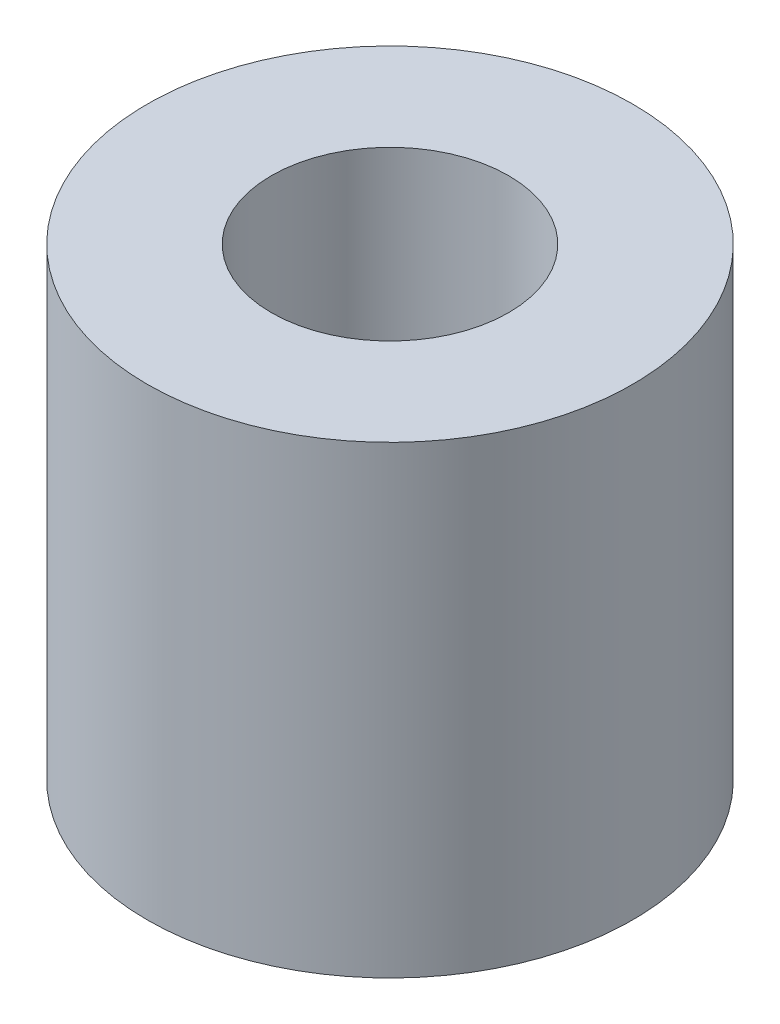
ISO-10303-21;
HEADER;
FILE_DESCRIPTION(('STEP AP214'),'2;1');
FILE_NAME('part.step','',(''),(''),'','','');
FILE_SCHEMA(('AUTOMOTIVE_DESIGN { 1 0 10303 214 1 1 1 1 }'));
ENDSEC;
DATA;
#1=APPLICATION_CONTEXT('core data for automotive mechanical design processes');
#2=APPLICATION_PROTOCOL_DEFINITION('international standard','automotive_design',2000,#1);
#3=PRODUCT_CONTEXT('',#1,'mechanical');
#4=PRODUCT('Part','Part','',(#3));
#5=PRODUCT_RELATED_PRODUCT_CATEGORY('part','',(#4));
#6=PRODUCT_DEFINITION_FORMATION('','',#4);
#7=PRODUCT_DEFINITION_CONTEXT('part definition',#1,'design');
#8=PRODUCT_DEFINITION('design','',#6,#7);
#9=PRODUCT_DEFINITION_SHAPE('','',#8);
#10=(LENGTH_UNIT() NAMED_UNIT(*) SI_UNIT(.MILLI.,.METRE.));
#11=(NAMED_UNIT(*) PLANE_ANGLE_UNIT() SI_UNIT($,.RADIAN.));
#12=(NAMED_UNIT(*) SI_UNIT($,.STERADIAN.) SOLID_ANGLE_UNIT());
#13=UNCERTAINTY_MEASURE_WITH_UNIT(LENGTH_MEASURE(1.E-05),#10,'distance_accuracy_value','');
#14=(GEOMETRIC_REPRESENTATION_CONTEXT(3) GLOBAL_UNCERTAINTY_ASSIGNED_CONTEXT((#13)) GLOBAL_UNIT_ASSIGNED_CONTEXT((#10,
#11,#12)) REPRESENTATION_CONTEXT('',''));
#15=CARTESIAN_POINT('',(0.,0.,0.));
#16=DIRECTION('',(0.,0.,1.));
#17=DIRECTION('',(1.,0.,0.));
#18=AXIS2_PLACEMENT_3D('',#15,#16,#17);
#19=CARTESIAN_POINT('',(0.,4.3,0.));
#20=DIRECTION('',(0.,1.,0.));
#21=DIRECTION('',(0.,0.,1.));
#22=AXIS2_PLACEMENT_3D('',#19,#20,#21);
#23=PLANE('',#22);
#24=CARTESIAN_POINT('',(0.,4.3,0.));
#25=DIRECTION('',(0.,1.,0.));
#26=DIRECTION('',(0.,0.,1.));
#27=AXIS2_PLACEMENT_3D('',#24,#25,#26);
#28=CIRCLE('',#27,2.25);
#29=CARTESIAN_POINT('',(0.,4.3,-2.25));
#30=VERTEX_POINT('',#29);
#31=EDGE_CURVE('E10',#30,#30,#28,.T.);
#32=ORIENTED_EDGE('',*,*,#31,.T.);
#33=EDGE_LOOP('',(#32));
#34=FACE_BOUND('',#33,.T.);
#35=CARTESIAN_POINT('',(0.,4.3,0.));
#36=DIRECTION('',(0.,1.,0.));
#37=DIRECTION('',(0.,0.,1.));
#38=AXIS2_PLACEMENT_3D('',#35,#36,#37);
#39=CIRCLE('',#38,1.1);
#40=CARTESIAN_POINT('',(0.,4.3,-1.1));
#41=VERTEX_POINT('',#40);
#42=EDGE_CURVE('E50',#41,#41,#39,.T.);
#43=ORIENTED_EDGE('',*,*,#42,.F.);
#44=EDGE_LOOP('',(#43));
#45=FACE_BOUND('',#44,.T.);
#46=ADVANCED_FACE('F37',(#34,#45),#23,.T.);
#47=CARTESIAN_POINT('',(0.,0.,0.));
#48=DIRECTION('',(0.,1.,0.));
#49=DIRECTION('',(0.,0.,1.));
#50=AXIS2_PLACEMENT_3D('',#47,#48,#49);
#51=PLANE('',#50);
#52=CARTESIAN_POINT('',(0.,0.,0.));
#53=DIRECTION('',(0.,1.,0.));
#54=DIRECTION('',(0.,0.,1.));
#55=AXIS2_PLACEMENT_3D('',#52,#53,#54);
#56=CIRCLE('',#55,2.25);
#57=CARTESIAN_POINT('',(0.,0.,-2.25));
#58=VERTEX_POINT('',#57);
#59=EDGE_CURVE('E41',#58,#58,#56,.T.);
#60=ORIENTED_EDGE('',*,*,#59,.F.);
#61=EDGE_LOOP('',(#60));
#62=FACE_BOUND('',#61,.T.);
#63=CARTESIAN_POINT('',(0.,0.,0.));
#64=DIRECTION('',(0.,1.,0.));
#65=DIRECTION('',(0.,0.,1.));
#66=AXIS2_PLACEMENT_3D('',#63,#64,#65);
#67=CIRCLE('',#66,1.1);
#68=CARTESIAN_POINT('',(0.,0.,-1.1));
#69=VERTEX_POINT('',#68);
#70=EDGE_CURVE('E52',#69,#69,#67,.T.);
#71=ORIENTED_EDGE('',*,*,#70,.T.);
#72=EDGE_LOOP('',(#71));
#73=FACE_BOUND('',#72,.T.);
#74=ADVANCED_FACE('F64',(#62,#73),#51,.F.);
#75=CARTESIAN_POINT('',(0.,4.3,0.));
#76=DIRECTION('',(0.,-1.,0.));
#77=DIRECTION('',(0.,0.,-1.));
#78=AXIS2_PLACEMENT_3D('',#75,#76,#77);
#79=CYLINDRICAL_SURFACE('',#78,2.25);
#80=CARTESIAN_POINT('',(0.,4.3,-2.25));
#81=CARTESIAN_POINT('',(0.,4.25520833333333,-2.25));
#82=CARTESIAN_POINT('',(0.,4.21041666666667,-2.25));
#83=CARTESIAN_POINT('',(0.,4.12083333333333,-2.25));
#84=CARTESIAN_POINT('',(0.,4.07604166666667,-2.25));
#85=CARTESIAN_POINT('',(0.,3.98645833333333,-2.25));
#86=CARTESIAN_POINT('',(0.,3.94166666666667,-2.25));
#87=CARTESIAN_POINT('',(0.,3.85208333333333,-2.25));
#88=CARTESIAN_POINT('',(0.,3.80729166666667,-2.25));
#89=CARTESIAN_POINT('',(0.,3.71770833333333,-2.25));
#90=CARTESIAN_POINT('',(0.,3.67291666666667,-2.25));
#91=CARTESIAN_POINT('',(0.,3.58333333333333,-2.25));
#92=CARTESIAN_POINT('',(0.,3.53854166666667,-2.25));
#93=CARTESIAN_POINT('',(0.,3.44895833333333,-2.25));
#94=CARTESIAN_POINT('',(0.,3.40416666666667,-2.25));
#95=CARTESIAN_POINT('',(0.,3.31458333333333,-2.25));
#96=CARTESIAN_POINT('',(0.,3.26979166666667,-2.25));
#97=CARTESIAN_POINT('',(0.,3.18020833333333,-2.25));
#98=CARTESIAN_POINT('',(0.,3.13541666666667,-2.25));
#99=CARTESIAN_POINT('',(0.,3.04583333333333,-2.25));
#100=CARTESIAN_POINT('',(0.,3.00104166666667,-2.25));
#101=CARTESIAN_POINT('',(0.,2.91145833333333,-2.25));
#102=CARTESIAN_POINT('',(0.,2.86666666666667,-2.25));
#103=CARTESIAN_POINT('',(0.,2.77708333333333,-2.25));
#104=CARTESIAN_POINT('',(0.,2.73229166666667,-2.25));
#105=CARTESIAN_POINT('',(0.,2.64270833333333,-2.25));
#106=CARTESIAN_POINT('',(0.,2.59791666666667,-2.25));
#107=CARTESIAN_POINT('',(0.,2.50833333333333,-2.25));
#108=CARTESIAN_POINT('',(0.,2.46354166666667,-2.25));
#109=CARTESIAN_POINT('',(0.,2.37395833333333,-2.25));
#110=CARTESIAN_POINT('',(0.,2.32916666666667,-2.25));
#111=CARTESIAN_POINT('',(0.,2.23958333333333,-2.25));
#112=CARTESIAN_POINT('',(0.,2.19479166666667,-2.25));
#113=CARTESIAN_POINT('',(0.,2.10520833333333,-2.25));
#114=CARTESIAN_POINT('',(0.,2.06041666666667,-2.25));
#115=CARTESIAN_POINT('',(0.,1.97083333333333,-2.25));
#116=CARTESIAN_POINT('',(0.,1.92604166666667,-2.25));
#117=CARTESIAN_POINT('',(0.,1.83645833333333,-2.25));
#118=CARTESIAN_POINT('',(0.,1.79166666666667,-2.25));
#119=CARTESIAN_POINT('',(0.,1.70208333333333,-2.25));
#120=CARTESIAN_POINT('',(0.,1.65729166666667,-2.25));
#121=CARTESIAN_POINT('',(0.,1.56770833333333,-2.25));
#122=CARTESIAN_POINT('',(0.,1.52291666666667,-2.25));
#123=CARTESIAN_POINT('',(0.,1.43333333333333,-2.25));
#124=CARTESIAN_POINT('',(0.,1.38854166666667,-2.25));
#125=CARTESIAN_POINT('',(0.,1.29895833333333,-2.25));
#126=CARTESIAN_POINT('',(0.,1.25416666666667,-2.25));
#127=CARTESIAN_POINT('',(0.,1.16458333333333,-2.25));
#128=CARTESIAN_POINT('',(0.,1.11979166666667,-2.25));
#129=CARTESIAN_POINT('',(0.,1.03020833333333,-2.25));
#130=CARTESIAN_POINT('',(0.,0.985416666666666,-2.25));
#131=CARTESIAN_POINT('',(0.,0.895833333333333,-2.25));
#132=CARTESIAN_POINT('',(0.,0.851041666666666,-2.25));
#133=CARTESIAN_POINT('',(0.,0.761458333333333,-2.25));
#134=CARTESIAN_POINT('',(0.,0.716666666666666,-2.25));
#135=CARTESIAN_POINT('',(0.,0.627083333333333,-2.25));
#136=CARTESIAN_POINT('',(0.,0.582291666666666,-2.25));
#137=CARTESIAN_POINT('',(0.,0.492708333333333,-2.25));
#138=CARTESIAN_POINT('',(0.,0.447916666666666,-2.25));
#139=CARTESIAN_POINT('',(0.,0.358333333333333,-2.25));
#140=CARTESIAN_POINT('',(0.,0.313541666666666,-2.25));
#141=CARTESIAN_POINT('',(0.,0.223958333333332,-2.25));
#142=CARTESIAN_POINT('',(0.,0.179166666666666,-2.25));
#143=CARTESIAN_POINT('',(0.,0.0895833333333324,-2.25));
#144=CARTESIAN_POINT('',(0.,0.0447916666666658,-2.25));
#145=CARTESIAN_POINT('',(0.,0.,-2.25));
#146=B_SPLINE_CURVE_WITH_KNOTS('',3,(#80,#81,#82,#83,#84,#85,#86,#87,#88,#89,#90,#91,#92,#93,
#94,#95,#96,#97,#98,#99,#100,#101,#102,#103,#104,#105,#106,#107,#108,#109,#110,#111,#112,#113,
#114,#115,#116,#117,#118,#119,#120,#121,#122,#123,#124,#125,#126,#127,#128,#129,#130,#131,#132,
#133,#134,#135,#136,#137,#138,#139,#140,#141,#142,#143,#144,#145),.UNSPECIFIED.,.F.,.F.,(4,2,2,
2,2,2,2,2,2,2,2,2,2,2,2,2,2,2,2,2,2,2,2,2,2,2,2,2,2,2,2,2,4),(0.,0.134375,0.26875,
0.403124999999999,0.5375,0.671875,0.80625,0.940625,1.075,1.209375,1.34375,1.478125,1.6125,
1.746875,1.88125,2.015625,2.15,2.284375,2.41875,2.553125,2.6875,2.821875,2.95625,3.090625,3.225,
3.359375,3.49375,3.628125,3.7625,3.896875,4.03125,4.165625,4.3),.UNSPECIFIED.);
#147=EDGE_CURVE('BSEAM39',#30,#58,#146,.T.);
#148=ORIENTED_EDGE('',*,*,#31,.F.);
#149=ORIENTED_EDGE('',*,*,#59,.T.);
#150=ORIENTED_EDGE('',*,*,#147,.T.);
#151=ORIENTED_EDGE('',*,*,#147,.F.);
#152=EDGE_LOOP('',(#148,#150,#149,#151));
#153=FACE_BOUND('',#152,.T.);
#154=ADVANCED_FACE('F39',(#153),#79,.T.);
#155=CARTESIAN_POINT('',(0.,4.3,0.));
#156=DIRECTION('',(0.,-1.,0.));
#157=DIRECTION('',(0.,0.,-1.));
#158=AXIS2_PLACEMENT_3D('',#155,#156,#157);
#159=CYLINDRICAL_SURFACE('',#158,1.1);
#160=CARTESIAN_POINT('',(0.,4.3,-1.1));
#161=CARTESIAN_POINT('',(0.,4.25520833333333,-1.1));
#162=CARTESIAN_POINT('',(0.,4.21041666666667,-1.1));
#163=CARTESIAN_POINT('',(0.,4.12083333333333,-1.1));
#164=CARTESIAN_POINT('',(0.,4.07604166666667,-1.1));
#165=CARTESIAN_POINT('',(0.,3.98645833333333,-1.1));
#166=CARTESIAN_POINT('',(0.,3.94166666666667,-1.1));
#167=CARTESIAN_POINT('',(0.,3.85208333333333,-1.1));
#168=CARTESIAN_POINT('',(0.,3.80729166666667,-1.1));
#169=CARTESIAN_POINT('',(0.,3.71770833333333,-1.1));
#170=CARTESIAN_POINT('',(0.,3.67291666666667,-1.1));
#171=CARTESIAN_POINT('',(0.,3.58333333333333,-1.1));
#172=CARTESIAN_POINT('',(0.,3.53854166666667,-1.1));
#173=CARTESIAN_POINT('',(0.,3.44895833333333,-1.1));
#174=CARTESIAN_POINT('',(0.,3.40416666666667,-1.1));
#175=CARTESIAN_POINT('',(0.,3.31458333333333,-1.1));
#176=CARTESIAN_POINT('',(0.,3.26979166666667,-1.1));
#177=CARTESIAN_POINT('',(0.,3.18020833333333,-1.1));
#178=CARTESIAN_POINT('',(0.,3.13541666666667,-1.1));
#179=CARTESIAN_POINT('',(0.,3.04583333333333,-1.1));
#180=CARTESIAN_POINT('',(0.,3.00104166666667,-1.1));
#181=CARTESIAN_POINT('',(0.,2.91145833333333,-1.1));
#182=CARTESIAN_POINT('',(0.,2.86666666666667,-1.1));
#183=CARTESIAN_POINT('',(0.,2.77708333333333,-1.1));
#184=CARTESIAN_POINT('',(0.,2.73229166666667,-1.1));
#185=CARTESIAN_POINT('',(0.,2.64270833333333,-1.1));
#186=CARTESIAN_POINT('',(0.,2.59791666666667,-1.1));
#187=CARTESIAN_POINT('',(0.,2.50833333333333,-1.1));
#188=CARTESIAN_POINT('',(0.,2.46354166666667,-1.1));
#189=CARTESIAN_POINT('',(0.,2.37395833333333,-1.1));
#190=CARTESIAN_POINT('',(0.,2.32916666666667,-1.1));
#191=CARTESIAN_POINT('',(0.,2.23958333333333,-1.1));
#192=CARTESIAN_POINT('',(0.,2.19479166666667,-1.1));
#193=CARTESIAN_POINT('',(0.,2.10520833333333,-1.1));
#194=CARTESIAN_POINT('',(0.,2.06041666666667,-1.1));
#195=CARTESIAN_POINT('',(0.,1.97083333333333,-1.1));
#196=CARTESIAN_POINT('',(0.,1.92604166666667,-1.1));
#197=CARTESIAN_POINT('',(0.,1.83645833333333,-1.1));
#198=CARTESIAN_POINT('',(0.,1.79166666666667,-1.1));
#199=CARTESIAN_POINT('',(0.,1.70208333333333,-1.1));
#200=CARTESIAN_POINT('',(0.,1.65729166666667,-1.1));
#201=CARTESIAN_POINT('',(0.,1.56770833333333,-1.1));
#202=CARTESIAN_POINT('',(0.,1.52291666666667,-1.1));
#203=CARTESIAN_POINT('',(0.,1.43333333333333,-1.1));
#204=CARTESIAN_POINT('',(0.,1.38854166666667,-1.1));
#205=CARTESIAN_POINT('',(0.,1.29895833333333,-1.1));
#206=CARTESIAN_POINT('',(0.,1.25416666666667,-1.1));
#207=CARTESIAN_POINT('',(0.,1.16458333333333,-1.1));
#208=CARTESIAN_POINT('',(0.,1.11979166666667,-1.1));
#209=CARTESIAN_POINT('',(0.,1.03020833333333,-1.1));
#210=CARTESIAN_POINT('',(0.,0.985416666666665,-1.1));
#211=CARTESIAN_POINT('',(0.,0.895833333333332,-1.1));
#212=CARTESIAN_POINT('',(0.,0.851041666666665,-1.1));
#213=CARTESIAN_POINT('',(0.,0.761458333333332,-1.1));
#214=CARTESIAN_POINT('',(0.,0.716666666666665,-1.1));
#215=CARTESIAN_POINT('',(0.,0.627083333333332,-1.1));
#216=CARTESIAN_POINT('',(0.,0.582291666666665,-1.1));
#217=CARTESIAN_POINT('',(0.,0.492708333333332,-1.1));
#218=CARTESIAN_POINT('',(0.,0.447916666666665,-1.1));
#219=CARTESIAN_POINT('',(0.,0.358333333333332,-1.1));
#220=CARTESIAN_POINT('',(0.,0.313541666666666,-1.1));
#221=CARTESIAN_POINT('',(0.,0.223958333333332,-1.1));
#222=CARTESIAN_POINT('',(0.,0.179166666666666,-1.1));
#223=CARTESIAN_POINT('',(0.,0.0895833333333324,-1.1));
#224=CARTESIAN_POINT('',(0.,0.0447916666666658,-1.1));
#225=CARTESIAN_POINT('',(0.,0.,-1.1));
#226=B_SPLINE_CURVE_WITH_KNOTS('',3,(#160,#161,#162,#163,#164,#165,#166,#167,#168,#169,#170,
#171,#172,#173,#174,#175,#176,#177,#178,#179,#180,#181,#182,#183,#184,#185,#186,#187,#188,#189,
#190,#191,#192,#193,#194,#195,#196,#197,#198,#199,#200,#201,#202,#203,#204,#205,#206,#207,#208,
#209,#210,#211,#212,#213,#214,#215,#216,#217,#218,#219,#220,#221,#222,#223,#224,#225),
.UNSPECIFIED.,.F.,.F.,(4,2,2,2,2,2,2,2,2,2,2,2,2,2,2,2,2,2,2,2,2,2,2,2,2,2,2,2,2,2,2,2,4),(0.,
0.134375000000001,0.268750000000001,0.403125000000001,0.537500000000001,0.671875000000001,
0.806250000000001,0.940625,1.075,1.209375,1.34375,1.478125,1.6125,1.746875,1.88125,2.015625,
2.15,2.284375,2.41875,2.553125,2.6875,2.821875,2.95625,3.090625,3.225,3.359375,3.49375,3.628125,
3.7625,3.896875,4.03125,4.165625,4.3),.UNSPECIFIED.);
#227=EDGE_CURVE('BSEAM60',#41,#69,#226,.T.);
#228=ORIENTED_EDGE('',*,*,#42,.T.);
#229=ORIENTED_EDGE('',*,*,#70,.F.);
#230=ORIENTED_EDGE('',*,*,#227,.T.);
#231=ORIENTED_EDGE('',*,*,#227,.F.);
#232=EDGE_LOOP('',(#228,#230,#229,#231));
#233=FACE_BOUND('',#232,.T.);
#234=ADVANCED_FACE('F60',(#233),#159,.F.);
#235=CLOSED_SHELL('',(#46,#74,#154,#234));
#236=MANIFOLD_SOLID_BREP('B2',#235);
#237=ADVANCED_BREP_SHAPE_REPRESENTATION('',(#18,#236),#14);
#238=SHAPE_DEFINITION_REPRESENTATION(#9,#237);
ENDSEC;
END-ISO-10303-21;
